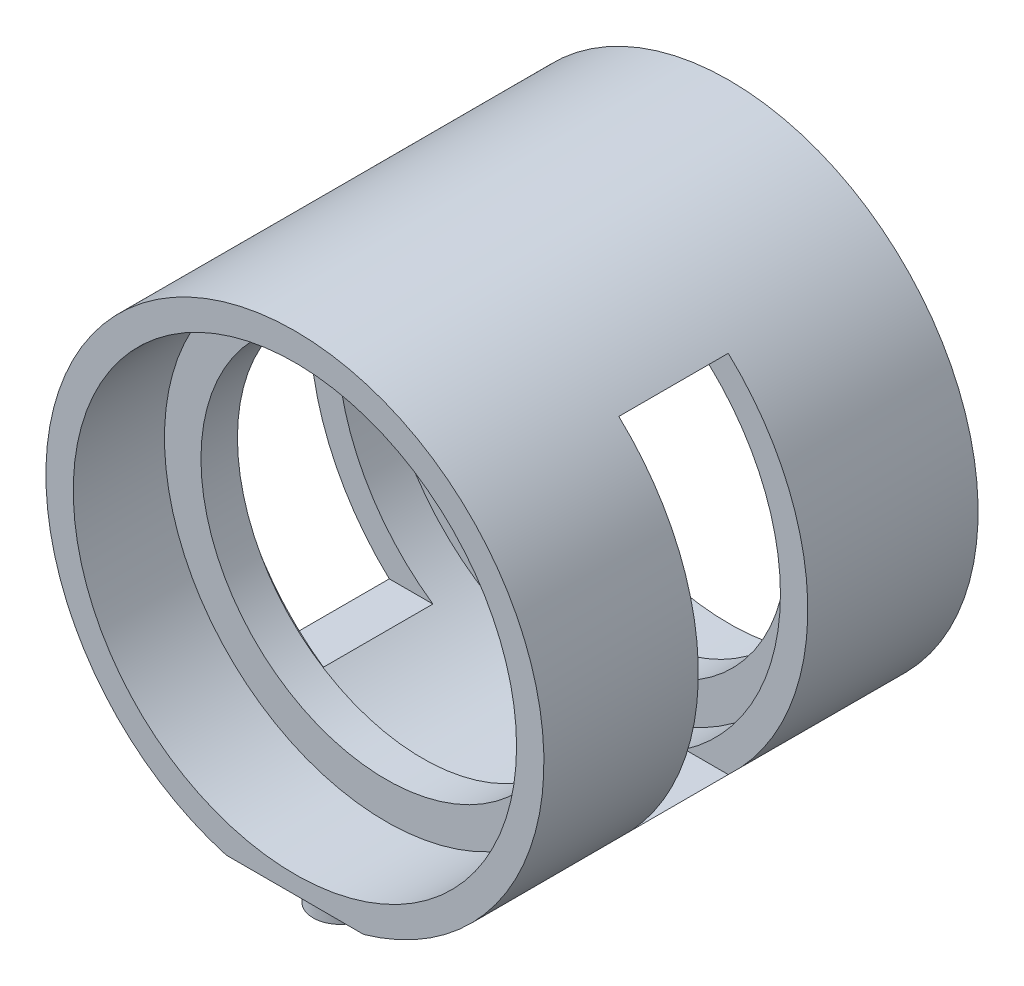
ISO-10303-21;
HEADER;
FILE_DESCRIPTION(('STEP AP214'),'2;1');
FILE_NAME('part.step','',(''),(''),'','','');
FILE_SCHEMA(('AUTOMOTIVE_DESIGN { 1 0 10303 214 1 1 1 1 }'));
ENDSEC;
DATA;
#1=APPLICATION_CONTEXT('core data for automotive mechanical design processes');
#2=APPLICATION_PROTOCOL_DEFINITION('international standard','automotive_design',2000,#1);
#3=PRODUCT_CONTEXT('',#1,'mechanical');
#4=PRODUCT('Part','Part','',(#3));
#5=PRODUCT_RELATED_PRODUCT_CATEGORY('part','',(#4));
#6=PRODUCT_DEFINITION_FORMATION('','',#4);
#7=PRODUCT_DEFINITION_CONTEXT('part definition',#1,'design');
#8=PRODUCT_DEFINITION('design','',#6,#7);
#9=PRODUCT_DEFINITION_SHAPE('','',#8);
#10=(LENGTH_UNIT() NAMED_UNIT(*) SI_UNIT(.MILLI.,.METRE.));
#11=(NAMED_UNIT(*) PLANE_ANGLE_UNIT() SI_UNIT($,.RADIAN.));
#12=(NAMED_UNIT(*) SI_UNIT($,.STERADIAN.) SOLID_ANGLE_UNIT());
#13=UNCERTAINTY_MEASURE_WITH_UNIT(LENGTH_MEASURE(1.E-05),#10,'distance_accuracy_value','');
#14=(GEOMETRIC_REPRESENTATION_CONTEXT(3) GLOBAL_UNCERTAINTY_ASSIGNED_CONTEXT((#13)) GLOBAL_UNIT_ASSIGNED_CONTEXT((#10,
#11,#12)) REPRESENTATION_CONTEXT('',''));
#15=CARTESIAN_POINT('',(0.,0.,0.));
#16=DIRECTION('',(0.,0.,1.));
#17=DIRECTION('',(1.,0.,0.));
#18=AXIS2_PLACEMENT_3D('',#15,#16,#17);
#19=CARTESIAN_POINT('',(0.,0.,23.8));
#20=DIRECTION('',(0.,0.,-1.));
#21=DIRECTION('',(-1.,0.,0.));
#22=AXIS2_PLACEMENT_3D('',#19,#20,#21);
#23=CYLINDRICAL_SURFACE('',#22,12.15);
#24=CARTESIAN_POINT('',(0.,0.,0.));
#25=DIRECTION('',(0.,0.,1.));
#26=DIRECTION('',(1.,0.,0.));
#27=AXIS2_PLACEMENT_3D('',#24,#25,#26);
#28=CIRCLE('',#27,12.15);
#29=CARTESIAN_POINT('',(12.15,0.,0.));
#30=VERTEX_POINT('',#29);
#31=EDGE_CURVE('E163',#30,#30,#28,.T.);
#32=ORIENTED_EDGE('',*,*,#31,.F.);
#33=EDGE_LOOP('',(#32));
#34=FACE_BOUND('',#33,.T.);
#35=CARTESIAN_POINT('',(0.,0.,5.));
#36=DIRECTION('',(0.,0.,1.));
#37=DIRECTION('',(1.,0.,0.));
#38=AXIS2_PLACEMENT_3D('',#35,#36,#37);
#39=CIRCLE('',#38,12.15);
#40=CARTESIAN_POINT('',(12.15,0.,5.));
#41=VERTEX_POINT('',#40);
#42=EDGE_CURVE('E148',#41,#41,#39,.T.);
#43=ORIENTED_EDGE('',*,*,#42,.T.);
#44=EDGE_LOOP('',(#43));
#45=FACE_BOUND('',#44,.T.);
#46=ADVANCED_FACE('F33',(#34,#45),#23,.F.);
#47=CARTESIAN_POINT('',(0.,0.,9.33575499715556));
#48=DIRECTION('',(0.,0.,-1.));
#49=DIRECTION('',(-1.,0.,0.));
#50=AXIS2_PLACEMENT_3D('',#47,#48,#49);
#51=CIRCLE('',#50,12.15);
#52=CARTESIAN_POINT('',(6.90090573765503,10.,9.33575499715556));
#53=VERTEX_POINT('',#52);
#54=CARTESIAN_POINT('',(6.90090573765502,-10.,9.33575499715556));
#55=VERTEX_POINT('',#54);
#56=EDGE_CURVE('E144',#53,#55,#51,.T.);
#57=ORIENTED_EDGE('',*,*,#56,.F.);
#58=DIRECTION('',(0.,0.,-1.));
#59=VECTOR('',#58,1.);
#60=CARTESIAN_POINT('',(6.90090573765503,10.,23.8));
#61=LINE('',#60,#59);
#62=CARTESIAN_POINT('',(6.90090573765503,10.,15.3357549971556));
#63=VERTEX_POINT('',#62);
#64=EDGE_CURVE('E119',#63,#53,#61,.T.);
#65=ORIENTED_EDGE('',*,*,#64,.F.);
#66=CARTESIAN_POINT('',(0.,0.,15.3357549971556));
#67=DIRECTION('',(0.,0.,1.));
#68=DIRECTION('',(1.,0.,0.));
#69=AXIS2_PLACEMENT_3D('',#66,#67,#68);
#70=CIRCLE('',#69,12.15);
#71=CARTESIAN_POINT('',(6.90090573765502,-10.,15.3357549971556));
#72=VERTEX_POINT('',#71);
#73=EDGE_CURVE('E136',#72,#63,#70,.T.);
#74=ORIENTED_EDGE('',*,*,#73,.F.);
#75=DIRECTION('',(0.,0.,-1.));
#76=VECTOR('',#75,1.);
#77=CARTESIAN_POINT('',(6.90090573765502,-10.,23.8));
#78=LINE('',#77,#76);
#79=EDGE_CURVE('E135',#55,#72,#78,.F.);
#80=ORIENTED_EDGE('',*,*,#79,.F.);
#81=EDGE_LOOP('',(#57,#65,#74,#80));
#82=FACE_BOUND('',#81,.T.);
#83=CARTESIAN_POINT('',(-6.90090573765502,-10.,9.33575499715556));
#84=VERTEX_POINT('',#83);
#85=CARTESIAN_POINT('',(-6.90090573765503,10.,9.33575499715556));
#86=VERTEX_POINT('',#85);
#87=EDGE_CURVE('E142',#84,#86,#51,.T.);
#88=ORIENTED_EDGE('',*,*,#87,.F.);
#89=DIRECTION('',(0.,0.,-1.));
#90=VECTOR('',#89,1.);
#91=CARTESIAN_POINT('',(-6.90090573765502,-10.,23.8));
#92=LINE('',#91,#90);
#93=CARTESIAN_POINT('',(-6.90090573765502,-10.,15.3357549971556));
#94=VERTEX_POINT('',#93);
#95=EDGE_CURVE('E134',#94,#84,#92,.T.);
#96=ORIENTED_EDGE('',*,*,#95,.F.);
#97=CARTESIAN_POINT('',(-6.90090573765503,10.,15.3357549971556));
#98=VERTEX_POINT('',#97);
#99=EDGE_CURVE('E125',#98,#94,#70,.T.);
#100=ORIENTED_EDGE('',*,*,#99,.F.);
#101=DIRECTION('',(0.,0.,-1.));
#102=VECTOR('',#101,1.);
#103=CARTESIAN_POINT('',(-6.90090573765503,10.,23.8));
#104=LINE('',#103,#102);
#105=EDGE_CURVE('E111',#86,#98,#104,.F.);
#106=ORIENTED_EDGE('',*,*,#105,.F.);
#107=EDGE_LOOP('',(#88,#96,#100,#106));
#108=FACE_BOUND('',#107,.T.);
#109=CARTESIAN_POINT('',(0.,0.,7.));
#110=DIRECTION('',(0.,0.,1.));
#111=DIRECTION('',(1.,0.,0.));
#112=AXIS2_PLACEMENT_3D('',#109,#110,#111);
#113=CIRCLE('',#112,12.15);
#114=CARTESIAN_POINT('',(12.15,0.,7.));
#115=VERTEX_POINT('',#114);
#116=EDGE_CURVE('E188',#115,#115,#113,.T.);
#117=ORIENTED_EDGE('',*,*,#116,.F.);
#118=EDGE_LOOP('',(#117));
#119=FACE_BOUND('',#118,.T.);
#120=CARTESIAN_POINT('',(0.,0.,16.8));
#121=DIRECTION('',(0.,0.,1.));
#122=DIRECTION('',(1.,0.,0.));
#123=AXIS2_PLACEMENT_3D('',#120,#121,#122);
#124=CIRCLE('',#123,12.15);
#125=CARTESIAN_POINT('',(12.15,0.,16.8));
#126=VERTEX_POINT('',#125);
#127=EDGE_CURVE('E158',#126,#126,#124,.T.);
#128=ORIENTED_EDGE('',*,*,#127,.T.);
#129=EDGE_LOOP('',(#128));
#130=FACE_BOUND('',#129,.T.);
#131=ADVANCED_FACE('F132',(#82,#108,#119,#130),#23,.F.);
#132=CARTESIAN_POINT('',(0.,-13.12,23.8));
#133=DIRECTION('',(0.,1.,0.));
#134=DIRECTION('',(0.,0.,1.));
#135=AXIS2_PLACEMENT_3D('',#132,#133,#134);
#136=PLANE('',#135);
#137=CARTESIAN_POINT('',(0.,-13.12,2.5));
#138=DIRECTION('',(0.,1.,0.));
#139=DIRECTION('',(0.,0.,1.));
#140=AXIS2_PLACEMENT_3D('',#137,#138,#139);
#141=CIRCLE('',#140,1.5);
#142=CARTESIAN_POINT('',(0.,-13.12,4.));
#143=VERTEX_POINT('',#142);
#144=EDGE_CURVE('E11',#143,#143,#141,.F.);
#145=ORIENTED_EDGE('',*,*,#144,.F.);
#146=EDGE_LOOP('',(#145));
#147=FACE_BOUND('',#146,.T.);
#148=CARTESIAN_POINT('',(0.,-13.12,21.3));
#149=DIRECTION('',(0.,1.,0.));
#150=DIRECTION('',(0.,0.,1.));
#151=AXIS2_PLACEMENT_3D('',#148,#149,#150);
#152=CIRCLE('',#151,1.5);
#153=CARTESIAN_POINT('',(0.,-13.12,22.8));
#154=VERTEX_POINT('',#153);
#155=EDGE_CURVE('E41',#154,#154,#152,.F.);
#156=ORIENTED_EDGE('',*,*,#155,.F.);
#157=EDGE_LOOP('',(#156));
#158=FACE_BOUND('',#157,.T.);
#159=DIRECTION('',(1.,0.,0.));
#160=VECTOR('',#159,1.);
#161=CARTESIAN_POINT('',(0.,-13.12,0.));
#162=LINE('',#161,#160);
#163=CARTESIAN_POINT('',(-3.76670943928517,-13.12,0.));
#164=VERTEX_POINT('',#163);
#165=CARTESIAN_POINT('',(3.76670943928517,-13.12,0.));
#166=VERTEX_POINT('',#165);
#167=EDGE_CURVE('E176',#164,#166,#162,.T.);
#168=ORIENTED_EDGE('',*,*,#167,.T.);
#169=DIRECTION('',(0.,0.,-1.));
#170=VECTOR('',#169,1.);
#171=CARTESIAN_POINT('',(3.76670943928517,-13.12,23.8));
#172=LINE('',#171,#170);
#173=CARTESIAN_POINT('',(3.76670943928517,-13.12,23.8));
#174=VERTEX_POINT('',#173);
#175=EDGE_CURVE('E182',#174,#166,#172,.T.);
#176=ORIENTED_EDGE('',*,*,#175,.F.);
#177=DIRECTION('',(1.,0.,0.));
#178=VECTOR('',#177,1.);
#179=CARTESIAN_POINT('',(0.,-13.12,23.8));
#180=LINE('',#179,#178);
#181=CARTESIAN_POINT('',(-3.76670943928517,-13.12,23.8));
#182=VERTEX_POINT('',#181);
#183=EDGE_CURVE('E167',#182,#174,#180,.T.);
#184=ORIENTED_EDGE('',*,*,#183,.F.);
#185=DIRECTION('',(0.,0.,-1.));
#186=VECTOR('',#185,1.);
#187=CARTESIAN_POINT('',(-3.76670943928517,-13.12,23.8));
#188=LINE('',#187,#186);
#189=EDGE_CURVE('E173',#182,#164,#188,.T.);
#190=ORIENTED_EDGE('',*,*,#189,.T.);
#191=EDGE_LOOP('',(#168,#176,#184,#190));
#192=FACE_BOUND('',#191,.T.);
#193=ADVANCED_FACE('F212',(#147,#158,#192),#136,.F.);
#194=CARTESIAN_POINT('',(0.,0.,18.8));
#195=DIRECTION('',(0.,0.,1.));
#196=DIRECTION('',(1.,0.,0.));
#197=AXIS2_PLACEMENT_3D('',#194,#195,#196);
#198=CIRCLE('',#197,12.15);
#199=CARTESIAN_POINT('',(12.15,0.,18.8));
#200=VERTEX_POINT('',#199);
#201=EDGE_CURVE('E185',#200,#200,#198,.T.);
#202=ORIENTED_EDGE('',*,*,#201,.F.);
#203=EDGE_LOOP('',(#202));
#204=FACE_BOUND('',#203,.T.);
#205=CARTESIAN_POINT('',(0.,0.,23.8));
#206=DIRECTION('',(0.,0.,1.));
#207=DIRECTION('',(1.,0.,0.));
#208=AXIS2_PLACEMENT_3D('',#205,#206,#207);
#209=CIRCLE('',#208,12.15);
#210=CARTESIAN_POINT('',(12.15,0.,23.8));
#211=VERTEX_POINT('',#210);
#212=EDGE_CURVE('E164',#211,#211,#209,.T.);
#213=ORIENTED_EDGE('',*,*,#212,.T.);
#214=EDGE_LOOP('',(#213));
#215=FACE_BOUND('',#214,.T.);
#216=ADVANCED_FACE('F35',(#204,#215),#23,.F.);
#217=CARTESIAN_POINT('',(0.,0.,23.8));
#218=DIRECTION('',(0.,0.,-1.));
#219=DIRECTION('',(-1.,0.,0.));
#220=AXIS2_PLACEMENT_3D('',#217,#218,#219);
#221=CYLINDRICAL_SURFACE('',#220,13.65);
#222=DIRECTION('',(0.,0.,-1.));
#223=VECTOR('',#222,1.);
#224=CARTESIAN_POINT('',(-9.29099025938571,10.,23.8));
#225=LINE('',#224,#223);
#226=CARTESIAN_POINT('',(-9.29099025938571,10.,9.33575499715556));
#227=VERTEX_POINT('',#226);
#228=CARTESIAN_POINT('',(-9.29099025938571,10.,15.3357549971556));
#229=VERTEX_POINT('',#228);
#230=EDGE_CURVE('E206',#227,#229,#225,.F.);
#231=ORIENTED_EDGE('',*,*,#230,.T.);
#232=CARTESIAN_POINT('',(0.,0.,15.3357549971556));
#233=DIRECTION('',(0.,0.,1.));
#234=DIRECTION('',(1.,0.,0.));
#235=AXIS2_PLACEMENT_3D('',#232,#233,#234);
#236=CIRCLE('',#235,13.65);
#237=CARTESIAN_POINT('',(-9.2909902593857,-10.,15.3357549971556));
#238=VERTEX_POINT('',#237);
#239=EDGE_CURVE('E128',#229,#238,#236,.T.);
#240=ORIENTED_EDGE('',*,*,#239,.T.);
#241=DIRECTION('',(0.,0.,-1.));
#242=VECTOR('',#241,1.);
#243=CARTESIAN_POINT('',(-9.2909902593857,-10.,23.8));
#244=LINE('',#243,#242);
#245=CARTESIAN_POINT('',(-9.2909902593857,-10.,9.33575499715556));
#246=VERTEX_POINT('',#245);
#247=EDGE_CURVE('E203',#238,#246,#244,.T.);
#248=ORIENTED_EDGE('',*,*,#247,.T.);
#249=CARTESIAN_POINT('',(0.,0.,9.33575499715556));
#250=DIRECTION('',(0.,0.,-1.));
#251=DIRECTION('',(-1.,0.,0.));
#252=AXIS2_PLACEMENT_3D('',#249,#250,#251);
#253=CIRCLE('',#252,13.65);
#254=EDGE_CURVE('E200',#246,#227,#253,.T.);
#255=ORIENTED_EDGE('',*,*,#254,.T.);
#256=EDGE_LOOP('',(#231,#240,#248,#255));
#257=FACE_BOUND('',#256,.T.);
#258=CARTESIAN_POINT('',(9.2909902593857,-10.,15.3357549971556));
#259=VERTEX_POINT('',#258);
#260=CARTESIAN_POINT('',(9.29099025938571,10.,15.3357549971556));
#261=VERTEX_POINT('',#260);
#262=EDGE_CURVE('E191',#259,#261,#236,.T.);
#263=ORIENTED_EDGE('',*,*,#262,.T.);
#264=DIRECTION('',(0.,0.,-1.));
#265=VECTOR('',#264,1.);
#266=CARTESIAN_POINT('',(9.29099025938571,10.,23.8));
#267=LINE('',#266,#265);
#268=CARTESIAN_POINT('',(9.29099025938571,10.,9.33575499715556));
#269=VERTEX_POINT('',#268);
#270=EDGE_CURVE('E199',#261,#269,#267,.T.);
#271=ORIENTED_EDGE('',*,*,#270,.T.);
#272=CARTESIAN_POINT('',(9.2909902593857,-10.,9.33575499715556));
#273=VERTEX_POINT('',#272);
#274=EDGE_CURVE('E196',#269,#273,#253,.T.);
#275=ORIENTED_EDGE('',*,*,#274,.T.);
#276=DIRECTION('',(0.,0.,-1.));
#277=VECTOR('',#276,1.);
#278=CARTESIAN_POINT('',(9.2909902593857,-10.,23.8));
#279=LINE('',#278,#277);
#280=EDGE_CURVE('E193',#273,#259,#279,.F.);
#281=ORIENTED_EDGE('',*,*,#280,.T.);
#282=EDGE_LOOP('',(#263,#271,#275,#281));
#283=FACE_BOUND('',#282,.T.);
#284=CARTESIAN_POINT('',(0.,0.,0.));
#285=DIRECTION('',(0.,0.,1.));
#286=DIRECTION('',(1.,0.,0.));
#287=AXIS2_PLACEMENT_3D('',#284,#285,#286);
#288=CIRCLE('',#287,13.65);
#289=EDGE_CURVE('E168',#166,#164,#288,.T.);
#290=ORIENTED_EDGE('',*,*,#289,.T.);
#291=ORIENTED_EDGE('',*,*,#189,.F.);
#292=CARTESIAN_POINT('',(0.,0.,23.8));
#293=DIRECTION('',(0.,0.,1.));
#294=DIRECTION('',(1.,0.,0.));
#295=AXIS2_PLACEMENT_3D('',#292,#293,#294);
#296=CIRCLE('',#295,13.65);
#297=EDGE_CURVE('E171',#174,#182,#296,.T.);
#298=ORIENTED_EDGE('',*,*,#297,.F.);
#299=ORIENTED_EDGE('',*,*,#175,.T.);
#300=EDGE_LOOP('',(#290,#291,#298,#299));
#301=FACE_BOUND('',#300,.T.);
#302=ADVANCED_FACE('F223',(#257,#283,#301),#221,.T.);
#303=CARTESIAN_POINT('',(0.,0.,23.8));
#304=DIRECTION('',(0.,0.,1.));
#305=DIRECTION('',(1.,0.,0.));
#306=AXIS2_PLACEMENT_3D('',#303,#304,#305);
#307=PLANE('',#306);
#308=ORIENTED_EDGE('',*,*,#212,.F.);
#309=EDGE_LOOP('',(#308));
#310=FACE_BOUND('',#309,.T.);
#311=ORIENTED_EDGE('',*,*,#183,.T.);
#312=ORIENTED_EDGE('',*,*,#297,.T.);
#313=EDGE_LOOP('',(#311,#312));
#314=FACE_BOUND('',#313,.T.);
#315=ADVANCED_FACE('F225',(#310,#314),#307,.T.);
#316=CARTESIAN_POINT('',(0.,0.,0.));
#317=DIRECTION('',(0.,0.,1.));
#318=DIRECTION('',(1.,0.,0.));
#319=AXIS2_PLACEMENT_3D('',#316,#317,#318);
#320=PLANE('',#319);
#321=ORIENTED_EDGE('',*,*,#31,.T.);
#322=EDGE_LOOP('',(#321));
#323=FACE_BOUND('',#322,.T.);
#324=ORIENTED_EDGE('',*,*,#167,.F.);
#325=ORIENTED_EDGE('',*,*,#289,.F.);
#326=EDGE_LOOP('',(#324,#325));
#327=FACE_BOUND('',#326,.T.);
#328=ADVANCED_FACE('F221',(#323,#327),#320,.F.);
#329=CARTESIAN_POINT('',(0.,0.,16.8));
#330=DIRECTION('',(0.,0.,1.));
#331=DIRECTION('',(1.,0.,0.));
#332=AXIS2_PLACEMENT_3D('',#329,#330,#331);
#333=PLANE('',#332);
#334=CARTESIAN_POINT('',(0.,0.,16.8));
#335=DIRECTION('',(0.,0.,1.));
#336=DIRECTION('',(1.,0.,0.));
#337=AXIS2_PLACEMENT_3D('',#334,#335,#336);
#338=CIRCLE('',#337,10.15);
#339=CARTESIAN_POINT('',(10.15,0.,16.8));
#340=VERTEX_POINT('',#339);
#341=EDGE_CURVE('E155',#340,#340,#338,.T.);
#342=ORIENTED_EDGE('',*,*,#341,.T.);
#343=EDGE_LOOP('',(#342));
#344=FACE_BOUND('',#343,.T.);
#345=ORIENTED_EDGE('',*,*,#127,.F.);
#346=EDGE_LOOP('',(#345));
#347=FACE_BOUND('',#346,.T.);
#348=ADVANCED_FACE('F233',(#344,#347),#333,.F.);
#349=CARTESIAN_POINT('',(0.,0.,18.8));
#350=DIRECTION('',(0.,0.,1.));
#351=DIRECTION('',(1.,0.,0.));
#352=AXIS2_PLACEMENT_3D('',#349,#350,#351);
#353=PLANE('',#352);
#354=CARTESIAN_POINT('',(0.,0.,18.8));
#355=DIRECTION('',(0.,0.,1.));
#356=DIRECTION('',(1.,0.,0.));
#357=AXIS2_PLACEMENT_3D('',#354,#355,#356);
#358=CIRCLE('',#357,10.15);
#359=CARTESIAN_POINT('',(10.15,0.,18.8));
#360=VERTEX_POINT('',#359);
#361=EDGE_CURVE('E154',#360,#360,#358,.T.);
#362=ORIENTED_EDGE('',*,*,#361,.F.);
#363=EDGE_LOOP('',(#362));
#364=FACE_BOUND('',#363,.T.);
#365=ORIENTED_EDGE('',*,*,#201,.T.);
#366=EDGE_LOOP('',(#365));
#367=FACE_BOUND('',#366,.T.);
#368=ADVANCED_FACE('F255',(#364,#367),#353,.T.);
#369=CARTESIAN_POINT('',(0.,0.,16.8));
#370=DIRECTION('',(0.,0.,1.));
#371=DIRECTION('',(1.,0.,0.));
#372=AXIS2_PLACEMENT_3D('',#369,#370,#371);
#373=CYLINDRICAL_SURFACE('',#372,10.15);
#374=ORIENTED_EDGE('',*,*,#341,.F.);
#375=EDGE_LOOP('',(#374));
#376=FACE_BOUND('',#375,.T.);
#377=ORIENTED_EDGE('',*,*,#361,.T.);
#378=EDGE_LOOP('',(#377));
#379=FACE_BOUND('',#378,.T.);
#380=ADVANCED_FACE('F257',(#376,#379),#373,.F.);
#381=CARTESIAN_POINT('',(0.,0.,7.));
#382=DIRECTION('',(0.,0.,1.));
#383=DIRECTION('',(1.,0.,0.));
#384=AXIS2_PLACEMENT_3D('',#381,#382,#383);
#385=PLANE('',#384);
#386=ORIENTED_EDGE('',*,*,#116,.T.);
#387=EDGE_LOOP('',(#386));
#388=FACE_BOUND('',#387,.T.);
#389=CARTESIAN_POINT('',(0.,0.,7.));
#390=DIRECTION('',(0.,0.,1.));
#391=DIRECTION('',(1.,0.,0.));
#392=AXIS2_PLACEMENT_3D('',#389,#390,#391);
#393=CIRCLE('',#392,10.15);
#394=CARTESIAN_POINT('',(10.15,0.,7.));
#395=VERTEX_POINT('',#394);
#396=EDGE_CURVE('E145',#395,#395,#393,.T.);
#397=ORIENTED_EDGE('',*,*,#396,.F.);
#398=EDGE_LOOP('',(#397));
#399=FACE_BOUND('',#398,.T.);
#400=ADVANCED_FACE('F263',(#388,#399),#385,.T.);
#401=CARTESIAN_POINT('',(0.,0.,5.));
#402=DIRECTION('',(0.,0.,1.));
#403=DIRECTION('',(1.,0.,0.));
#404=AXIS2_PLACEMENT_3D('',#401,#402,#403);
#405=PLANE('',#404);
#406=ORIENTED_EDGE('',*,*,#42,.F.);
#407=EDGE_LOOP('',(#406));
#408=FACE_BOUND('',#407,.T.);
#409=CARTESIAN_POINT('',(0.,0.,5.));
#410=DIRECTION('',(0.,0.,1.));
#411=DIRECTION('',(1.,0.,0.));
#412=AXIS2_PLACEMENT_3D('',#409,#410,#411);
#413=CIRCLE('',#412,10.15);
#414=CARTESIAN_POINT('',(10.15,0.,5.));
#415=VERTEX_POINT('',#414);
#416=EDGE_CURVE('E149',#415,#415,#413,.T.);
#417=ORIENTED_EDGE('',*,*,#416,.T.);
#418=EDGE_LOOP('',(#417));
#419=FACE_BOUND('',#418,.T.);
#420=ADVANCED_FACE('F270',(#408,#419),#405,.F.);
#421=CARTESIAN_POINT('',(0.,0.,7.));
#422=DIRECTION('',(0.,0.,-1.));
#423=DIRECTION('',(-1.,0.,0.));
#424=AXIS2_PLACEMENT_3D('',#421,#422,#423);
#425=CYLINDRICAL_SURFACE('',#424,10.15);
#426=ORIENTED_EDGE('',*,*,#396,.T.);
#427=EDGE_LOOP('',(#426));
#428=FACE_BOUND('',#427,.T.);
#429=ORIENTED_EDGE('',*,*,#416,.F.);
#430=EDGE_LOOP('',(#429));
#431=FACE_BOUND('',#430,.T.);
#432=ADVANCED_FACE('F273',(#428,#431),#425,.F.);
#433=CARTESIAN_POINT('',(-13.65,10.,15.3357549971556));
#434=DIRECTION('',(0.,1.,0.));
#435=DIRECTION('',(0.,0.,1.));
#436=AXIS2_PLACEMENT_3D('',#433,#434,#435);
#437=PLANE('',#436);
#438=ORIENTED_EDGE('',*,*,#105,.T.);
#439=DIRECTION('',(1.,0.,0.));
#440=VECTOR('',#439,1.);
#441=CARTESIAN_POINT('',(-13.65,10.,15.3357549971556));
#442=LINE('',#441,#440);
#443=EDGE_CURVE('E114',#229,#98,#442,.T.);
#444=ORIENTED_EDGE('',*,*,#443,.F.);
#445=ORIENTED_EDGE('',*,*,#230,.F.);
#446=DIRECTION('',(1.,0.,0.));
#447=VECTOR('',#446,1.);
#448=CARTESIAN_POINT('',(-13.65,10.,9.33575499715556));
#449=LINE('',#448,#447);
#450=EDGE_CURVE('E56',#227,#86,#449,.T.);
#451=ORIENTED_EDGE('',*,*,#450,.T.);
#452=EDGE_LOOP('',(#438,#444,#445,#451));
#453=FACE_BOUND('',#452,.T.);
#454=ADVANCED_FACE('F113',(#453),#437,.F.);
#455=CARTESIAN_POINT('',(-13.65,-10.,15.3357549971556));
#456=DIRECTION('',(0.,0.,1.));
#457=DIRECTION('',(1.,0.,0.));
#458=AXIS2_PLACEMENT_3D('',#455,#456,#457);
#459=PLANE('',#458);
#460=ORIENTED_EDGE('',*,*,#99,.T.);
#461=DIRECTION('',(1.,0.,0.));
#462=VECTOR('',#461,1.);
#463=CARTESIAN_POINT('',(-13.65,-10.,15.3357549971556));
#464=LINE('',#463,#462);
#465=EDGE_CURVE('E325',#238,#94,#464,.T.);
#466=ORIENTED_EDGE('',*,*,#465,.F.);
#467=ORIENTED_EDGE('',*,*,#239,.F.);
#468=ORIENTED_EDGE('',*,*,#443,.T.);
#469=EDGE_LOOP('',(#460,#466,#467,#468));
#470=FACE_BOUND('',#469,.T.);
#471=ADVANCED_FACE('F123',(#470),#459,.F.);
#472=CARTESIAN_POINT('',(-13.65,-10.,15.3357549971556));
#473=DIRECTION('',(0.,-1.,0.));
#474=DIRECTION('',(0.,0.,-1.));
#475=AXIS2_PLACEMENT_3D('',#472,#473,#474);
#476=PLANE('',#475);
#477=ORIENTED_EDGE('',*,*,#95,.T.);
#478=DIRECTION('',(1.,0.,0.));
#479=VECTOR('',#478,1.);
#480=CARTESIAN_POINT('',(-13.65,-10.,9.33575499715556));
#481=LINE('',#480,#479);
#482=EDGE_CURVE('E120',#246,#84,#481,.T.);
#483=ORIENTED_EDGE('',*,*,#482,.F.);
#484=ORIENTED_EDGE('',*,*,#247,.F.);
#485=ORIENTED_EDGE('',*,*,#465,.T.);
#486=EDGE_LOOP('',(#477,#483,#484,#485));
#487=FACE_BOUND('',#486,.T.);
#488=ADVANCED_FACE('F293',(#487),#476,.F.);
#489=CARTESIAN_POINT('',(-13.65,-10.,9.33575499715556));
#490=DIRECTION('',(0.,0.,-1.));
#491=DIRECTION('',(-1.,0.,0.));
#492=AXIS2_PLACEMENT_3D('',#489,#490,#491);
#493=PLANE('',#492);
#494=ORIENTED_EDGE('',*,*,#87,.T.);
#495=ORIENTED_EDGE('',*,*,#450,.F.);
#496=ORIENTED_EDGE('',*,*,#254,.F.);
#497=ORIENTED_EDGE('',*,*,#482,.T.);
#498=EDGE_LOOP('',(#494,#495,#496,#497));
#499=FACE_BOUND('',#498,.T.);
#500=ADVANCED_FACE('F285',(#499),#493,.F.);
#501=ORIENTED_EDGE('',*,*,#56,.T.);
#502=EDGE_CURVE('E322',#55,#273,#481,.T.);
#503=ORIENTED_EDGE('',*,*,#502,.T.);
#504=ORIENTED_EDGE('',*,*,#274,.F.);
#505=EDGE_CURVE('E319',#53,#269,#449,.T.);
#506=ORIENTED_EDGE('',*,*,#505,.F.);
#507=EDGE_LOOP('',(#501,#503,#504,#506));
#508=FACE_BOUND('',#507,.T.);
#509=ADVANCED_FACE('F281',(#508),#493,.F.);
#510=ORIENTED_EDGE('',*,*,#79,.T.);
#511=EDGE_CURVE('E129',#72,#259,#464,.T.);
#512=ORIENTED_EDGE('',*,*,#511,.T.);
#513=ORIENTED_EDGE('',*,*,#280,.F.);
#514=ORIENTED_EDGE('',*,*,#502,.F.);
#515=EDGE_LOOP('',(#510,#512,#513,#514));
#516=FACE_BOUND('',#515,.T.);
#517=ADVANCED_FACE('F284',(#516),#476,.F.);
#518=ORIENTED_EDGE('',*,*,#73,.T.);
#519=EDGE_CURVE('E48',#63,#261,#442,.T.);
#520=ORIENTED_EDGE('',*,*,#519,.T.);
#521=ORIENTED_EDGE('',*,*,#262,.F.);
#522=ORIENTED_EDGE('',*,*,#511,.F.);
#523=EDGE_LOOP('',(#518,#520,#521,#522));
#524=FACE_BOUND('',#523,.T.);
#525=ADVANCED_FACE('F290',(#524),#459,.F.);
#526=ORIENTED_EDGE('',*,*,#64,.T.);
#527=ORIENTED_EDGE('',*,*,#505,.T.);
#528=ORIENTED_EDGE('',*,*,#270,.F.);
#529=ORIENTED_EDGE('',*,*,#519,.F.);
#530=EDGE_LOOP('',(#526,#527,#528,#529));
#531=FACE_BOUND('',#530,.T.);
#532=ADVANCED_FACE('F287',(#531),#437,.F.);
#533=CARTESIAN_POINT('',(0.,-14.72,21.3));
#534=DIRECTION('',(0.,1.,0.));
#535=DIRECTION('',(0.,0.,1.));
#536=AXIS2_PLACEMENT_3D('',#533,#534,#535);
#537=CYLINDRICAL_SURFACE('',#536,1.5);
#538=CARTESIAN_POINT('',(0.,-14.72,21.3));
#539=DIRECTION('',(0.,-1.,0.));
#540=DIRECTION('',(0.,0.,-1.));
#541=AXIS2_PLACEMENT_3D('',#538,#539,#540);
#542=CIRCLE('',#541,1.5);
#543=CARTESIAN_POINT('',(0.,-14.72,19.8));
#544=VERTEX_POINT('',#543);
#545=EDGE_CURVE('E316',#544,#544,#542,.T.);
#546=ORIENTED_EDGE('',*,*,#545,.F.);
#547=EDGE_LOOP('',(#546));
#548=FACE_BOUND('',#547,.T.);
#549=ORIENTED_EDGE('',*,*,#155,.T.);
#550=EDGE_LOOP('',(#549));
#551=FACE_BOUND('',#550,.T.);
#552=ADVANCED_FACE('F210',(#548,#551),#537,.T.);
#553=CARTESIAN_POINT('',(0.,-14.72,21.3));
#554=DIRECTION('',(0.,-1.,0.));
#555=DIRECTION('',(0.,0.,-1.));
#556=AXIS2_PLACEMENT_3D('',#553,#554,#555);
#557=PLANE('',#556);
#558=ORIENTED_EDGE('',*,*,#545,.T.);
#559=EDGE_LOOP('',(#558));
#560=FACE_BOUND('',#559,.T.);
#561=ADVANCED_FACE('F299',(#560),#557,.T.);
#562=CARTESIAN_POINT('',(0.,-14.72,2.5));
#563=DIRECTION('',(0.,1.,0.));
#564=DIRECTION('',(0.,0.,1.));
#565=AXIS2_PLACEMENT_3D('',#562,#563,#564);
#566=CYLINDRICAL_SURFACE('',#565,1.5);
#567=CARTESIAN_POINT('',(0.,-14.72,2.5));
#568=DIRECTION('',(0.,-1.,0.));
#569=DIRECTION('',(0.,0.,-1.));
#570=AXIS2_PLACEMENT_3D('',#567,#568,#569);
#571=CIRCLE('',#570,1.5);
#572=CARTESIAN_POINT('',(0.,-14.72,1.));
#573=VERTEX_POINT('',#572);
#574=EDGE_CURVE('E315',#573,#573,#571,.T.);
#575=ORIENTED_EDGE('',*,*,#574,.F.);
#576=EDGE_LOOP('',(#575));
#577=FACE_BOUND('',#576,.T.);
#578=ORIENTED_EDGE('',*,*,#144,.T.);
#579=EDGE_LOOP('',(#578));
#580=FACE_BOUND('',#579,.T.);
#581=ADVANCED_FACE('F303',(#577,#580),#566,.T.);
#582=CARTESIAN_POINT('',(0.,-14.72,2.5));
#583=DIRECTION('',(0.,-1.,0.));
#584=DIRECTION('',(0.,0.,-1.));
#585=AXIS2_PLACEMENT_3D('',#582,#583,#584);
#586=PLANE('',#585);
#587=ORIENTED_EDGE('',*,*,#574,.T.);
#588=EDGE_LOOP('',(#587));
#589=FACE_BOUND('',#588,.T.);
#590=ADVANCED_FACE('F307',(#589),#586,.T.);
#591=CLOSED_SHELL('',(#46,#131,#193,#216,#302,#315,#328,#348,#368,#380,#400,#420,#432,#454,#471,
#488,#500,#509,#517,#525,#532,#552,#561,#581,#590));
#592=MANIFOLD_SOLID_BREP('B2',#591);
#593=ADVANCED_BREP_SHAPE_REPRESENTATION('',(#18,#592),#14);
#594=SHAPE_DEFINITION_REPRESENTATION(#9,#593);
ENDSEC;
END-ISO-10303-21;
